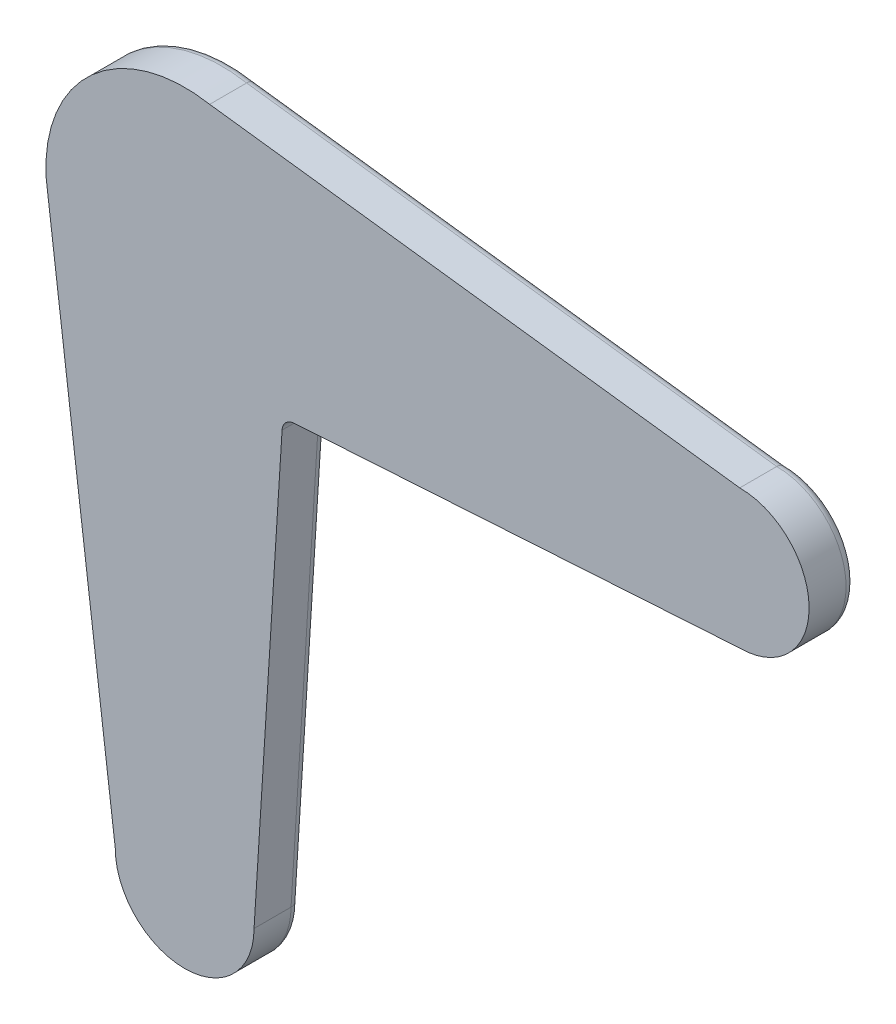
ISO-10303-21;
HEADER;
FILE_DESCRIPTION(('STEP AP214'),'2;1');
FILE_NAME('part.step','',(''),(''),'','','');
FILE_SCHEMA(('AUTOMOTIVE_DESIGN { 1 0 10303 214 1 1 1 1 }'));
ENDSEC;
DATA;
#1=APPLICATION_CONTEXT('core data for automotive mechanical design processes');
#2=APPLICATION_PROTOCOL_DEFINITION('international standard','automotive_design',2000,#1);
#3=PRODUCT_CONTEXT('',#1,'mechanical');
#4=PRODUCT('Part','Part','',(#3));
#5=PRODUCT_RELATED_PRODUCT_CATEGORY('part','',(#4));
#6=PRODUCT_DEFINITION_FORMATION('','',#4);
#7=PRODUCT_DEFINITION_CONTEXT('part definition',#1,'design');
#8=PRODUCT_DEFINITION('design','',#6,#7);
#9=PRODUCT_DEFINITION_SHAPE('','',#8);
#10=(LENGTH_UNIT() NAMED_UNIT(*) SI_UNIT(.MILLI.,.METRE.));
#11=(NAMED_UNIT(*) PLANE_ANGLE_UNIT() SI_UNIT($,.RADIAN.));
#12=(NAMED_UNIT(*) SI_UNIT($,.STERADIAN.) SOLID_ANGLE_UNIT());
#13=UNCERTAINTY_MEASURE_WITH_UNIT(LENGTH_MEASURE(1.E-05),#10,'distance_accuracy_value','');
#14=(GEOMETRIC_REPRESENTATION_CONTEXT(3) GLOBAL_UNCERTAINTY_ASSIGNED_CONTEXT((#13)) GLOBAL_UNIT_ASSIGNED_CONTEXT((#10,
#11,#12)) REPRESENTATION_CONTEXT('',''));
#15=CARTESIAN_POINT('',(0.,0.,0.));
#16=DIRECTION('',(0.,0.,1.));
#17=DIRECTION('',(1.,0.,0.));
#18=AXIS2_PLACEMENT_3D('',#15,#16,#17);
#19=CARTESIAN_POINT('',(93.5829057132578,739.119512955008,50.));
#20=DIRECTION('',(0.125611196920557,0.992079546814763,0.));
#21=DIRECTION('',(-0.992079546814763,0.125611196920557,0.));
#22=AXIS2_PLACEMENT_3D('',#19,#20,#21);
#23=PLANE('',#22);
#24=DIRECTION('',(0.,0.,-1.));
#25=VECTOR('',#24,1.);
#26=CARTESIAN_POINT('',(600.,675.,50.));
#27=LINE('',#26,#25);
#28=CARTESIAN_POINT('',(600.,675.,50.));
#29=VERTEX_POINT('',#28);
#30=CARTESIAN_POINT('',(600.,675.,9.99999999999999));
#31=VERTEX_POINT('',#30);
#32=EDGE_CURVE('E210',#29,#31,#27,.T.);
#33=ORIENTED_EDGE('',*,*,#32,.T.);
#34=DIRECTION('',(0.992079546814763,-0.125611196920557,0.));
#35=VECTOR('',#34,1.);
#36=CARTESIAN_POINT('',(27.0026258161435,747.54951100913,10.));
#37=LINE('',#36,#35);
#38=CARTESIAN_POINT('',(27.0026258161435,747.54951100913,9.99999999999999));
#39=VERTEX_POINT('',#38);
#40=EDGE_CURVE('E11',#31,#39,#37,.F.);
#41=ORIENTED_EDGE('',*,*,#40,.T.);
#42=DIRECTION('',(0.,0.,-1.));
#43=VECTOR('',#42,1.);
#44=CARTESIAN_POINT('',(27.0026258161435,747.54951100913,50.));
#45=LINE('',#44,#43);
#46=CARTESIAN_POINT('',(27.0026258161435,747.54951100913,50.));
#47=VERTEX_POINT('',#46);
#48=EDGE_CURVE('E230',#47,#39,#45,.T.);
#49=ORIENTED_EDGE('',*,*,#48,.F.);
#50=DIRECTION('',(0.992079546814763,-0.125611196920557,0.));
#51=VECTOR('',#50,1.);
#52=CARTESIAN_POINT('',(93.5829057132578,739.119512955008,50.));
#53=LINE('',#52,#51);
#54=EDGE_CURVE('E191',#47,#29,#53,.T.);
#55=ORIENTED_EDGE('',*,*,#54,.T.);
#56=EDGE_LOOP('',(#33,#41,#49,#55));
#57=FACE_BOUND('',#56,.T.);
#58=ADVANCED_FACE('F35',(#57),#23,.T.);
#59=CARTESIAN_POINT('',(0.,600.,50.));
#60=DIRECTION('',(0.,0.,-1.));
#61=DIRECTION('',(-1.,0.,0.));
#62=AXIS2_PLACEMENT_3D('',#59,#60,#61);
#63=CYLINDRICAL_SURFACE('',#62,150.);
#64=ORIENTED_EDGE('',*,*,#48,.T.);
#65=CARTESIAN_POINT('',(0.,600.,9.99999999999999));
#66=DIRECTION('',(0.,0.,1.));
#67=DIRECTION('',(1.,0.,0.));
#68=AXIS2_PLACEMENT_3D('',#65,#66,#67);
#69=CIRCLE('',#68,150.);
#70=CARTESIAN_POINT('',(-147.54951100913,572.997374183855,9.99999999999999));
#71=VERTEX_POINT('',#70);
#72=EDGE_CURVE('E44',#39,#71,#69,.T.);
#73=ORIENTED_EDGE('',*,*,#72,.T.);
#74=DIRECTION('',(0.,0.,-1.));
#75=VECTOR('',#74,1.);
#76=CARTESIAN_POINT('',(-147.54951100913,572.997374183855,50.));
#77=LINE('',#76,#75);
#78=CARTESIAN_POINT('',(-147.54951100913,572.997374183855,50.));
#79=VERTEX_POINT('',#78);
#80=EDGE_CURVE('E227',#79,#71,#77,.T.);
#81=ORIENTED_EDGE('',*,*,#80,.F.);
#82=CARTESIAN_POINT('',(0.,600.,50.));
#83=DIRECTION('',(0.,0.,1.));
#84=DIRECTION('',(1.,0.,0.));
#85=AXIS2_PLACEMENT_3D('',#82,#83,#84);
#86=CIRCLE('',#85,150.);
#87=EDGE_CURVE('E194',#47,#79,#86,.T.);
#88=ORIENTED_EDGE('',*,*,#87,.F.);
#89=EDGE_LOOP('',(#64,#73,#81,#88));
#90=FACE_BOUND('',#89,.T.);
#91=ADVANCED_FACE('F374',(#90),#63,.T.);
#92=CARTESIAN_POINT('',(-73.8166370406139,-9.34622244868542,50.));
#93=DIRECTION('',(-0.992079546814763,-0.125611196920556,0.));
#94=DIRECTION('',(0.125611196920556,-0.992079546814763,0.));
#95=AXIS2_PLACEMENT_3D('',#92,#93,#94);
#96=PLANE('',#95);
#97=ORIENTED_EDGE('',*,*,#80,.T.);
#98=DIRECTION('',(-0.125611196920556,0.992079546814763,0.));
#99=VECTOR('',#98,1.);
#100=CARTESIAN_POINT('',(-75.,0.,10.));
#101=LINE('',#100,#99);
#102=CARTESIAN_POINT('',(-75.,0.,9.99999999999999));
#103=VERTEX_POINT('',#102);
#104=EDGE_CURVE('E255',#71,#103,#101,.F.);
#105=ORIENTED_EDGE('',*,*,#104,.T.);
#106=DIRECTION('',(0.,0.,-1.));
#107=VECTOR('',#106,1.);
#108=CARTESIAN_POINT('',(-75.,0.,50.));
#109=LINE('',#108,#107);
#110=CARTESIAN_POINT('',(-75.,0.,50.));
#111=VERTEX_POINT('',#110);
#112=EDGE_CURVE('E224',#111,#103,#109,.T.);
#113=ORIENTED_EDGE('',*,*,#112,.F.);
#114=DIRECTION('',(-0.125611196920556,0.992079546814763,0.));
#115=VECTOR('',#114,1.);
#116=CARTESIAN_POINT('',(-73.8166370406139,-9.34622244868542,50.));
#117=LINE('',#116,#115);
#118=EDGE_CURVE('E196',#111,#79,#117,.T.);
#119=ORIENTED_EDGE('',*,*,#118,.T.);
#120=EDGE_LOOP('',(#97,#105,#113,#119));
#121=FACE_BOUND('',#120,.T.);
#122=ADVANCED_FACE('F377',(#121),#96,.T.);
#123=CARTESIAN_POINT('',(0.,0.,50.));
#124=DIRECTION('',(0.,0.,-1.));
#125=DIRECTION('',(-1.,0.,0.));
#126=AXIS2_PLACEMENT_3D('',#123,#124,#125);
#127=CYLINDRICAL_SURFACE('',#126,75.);
#128=ORIENTED_EDGE('',*,*,#112,.T.);
#129=CARTESIAN_POINT('',(0.,0.,9.99999999999999));
#130=DIRECTION('',(0.,0.,1.));
#131=DIRECTION('',(1.,0.,0.));
#132=AXIS2_PLACEMENT_3D('',#129,#130,#131);
#133=CIRCLE('',#132,75.);
#134=CARTESIAN_POINT('',(75.,0.,9.99999999999999));
#135=VERTEX_POINT('',#134);
#136=EDGE_CURVE('E258',#103,#135,#133,.T.);
#137=ORIENTED_EDGE('',*,*,#136,.T.);
#138=DIRECTION('',(0.,0.,-1.));
#139=VECTOR('',#138,1.);
#140=CARTESIAN_POINT('',(75.,0.,50.));
#141=LINE('',#140,#139);
#142=CARTESIAN_POINT('',(75.,0.,50.));
#143=VERTEX_POINT('',#142);
#144=EDGE_CURVE('E221',#143,#135,#141,.T.);
#145=ORIENTED_EDGE('',*,*,#144,.F.);
#146=CARTESIAN_POINT('',(0.,0.,50.));
#147=DIRECTION('',(0.,0.,1.));
#148=DIRECTION('',(1.,0.,0.));
#149=AXIS2_PLACEMENT_3D('',#146,#147,#148);
#150=CIRCLE('',#149,75.);
#151=EDGE_CURVE('E199',#111,#143,#150,.T.);
#152=ORIENTED_EDGE('',*,*,#151,.F.);
#153=EDGE_LOOP('',(#128,#137,#145,#152));
#154=FACE_BOUND('',#153,.T.);
#155=ADVANCED_FACE('F400',(#154),#127,.T.);
#156=CARTESIAN_POINT('',(74.7044846688428,-4.69854451142478,50.));
#157=DIRECTION('',(-0.998027953308208,0.0627710475890688,0.));
#158=DIRECTION('',(-0.0627710475890688,-0.998027953308208,0.));
#159=AXIS2_PLACEMENT_3D('',#156,#157,#158);
#160=PLANE('',#159);
#161=ORIENTED_EDGE('',*,*,#144,.T.);
#162=DIRECTION('',(0.0627710475890688,0.998027953308208,0.));
#163=VECTOR('',#162,1.);
#164=CARTESIAN_POINT('',(74.7044846688428,-4.69854451142478,9.99999999999999));
#165=LINE('',#164,#163);
#166=CARTESIAN_POINT('',(105.301411619995,481.777140624301,9.99999999999999));
#167=VERTEX_POINT('',#166);
#168=EDGE_CURVE('E264',#135,#167,#165,.T.);
#169=ORIENTED_EDGE('',*,*,#168,.T.);
#170=DIRECTION('',(0.,0.,-1.));
#171=VECTOR('',#170,1.);
#172=CARTESIAN_POINT('',(105.301411619995,481.777140624301,50.));
#173=LINE('',#172,#171);
#174=CARTESIAN_POINT('',(105.301411619995,481.777140624301,50.));
#175=VERTEX_POINT('',#174);
#176=EDGE_CURVE('E218',#175,#167,#173,.T.);
#177=ORIENTED_EDGE('',*,*,#176,.F.);
#178=DIRECTION('',(0.0627710475890688,0.998027953308208,0.));
#179=VECTOR('',#178,1.);
#180=CARTESIAN_POINT('',(74.7044846688428,-4.69854451142478,50.));
#181=LINE('',#180,#179);
#182=EDGE_CURVE('E201',#143,#175,#181,.T.);
#183=ORIENTED_EDGE('',*,*,#182,.F.);
#184=EDGE_LOOP('',(#161,#169,#177,#183));
#185=FACE_BOUND('',#184,.T.);
#186=ADVANCED_FACE('F398',(#185),#160,.F.);
#187=CARTESIAN_POINT('',(119.090100031217,480.909899968783,50.));
#188=DIRECTION('',(0.,0.,-1.));
#189=DIRECTION('',(-1.,0.,0.));
#190=AXIS2_PLACEMENT_3D('',#187,#188,#189);
#191=CYLINDRICAL_SURFACE('',#190,13.8159340783146);
#192=ORIENTED_EDGE('',*,*,#176,.T.);
#193=CARTESIAN_POINT('',(119.090100031217,480.909899968783,9.99999999999999));
#194=DIRECTION('',(0.,0.,1.));
#195=DIRECTION('',(1.,0.,0.));
#196=AXIS2_PLACEMENT_3D('',#193,#194,#195);
#197=CIRCLE('',#196,13.8159340783146);
#198=CARTESIAN_POINT('',(118.222859375699,494.698588380005,9.99999999999999));
#199=VERTEX_POINT('',#198);
#200=EDGE_CURVE('E262',#167,#199,#197,.F.);
#201=ORIENTED_EDGE('',*,*,#200,.T.);
#202=DIRECTION('',(0.,0.,-1.));
#203=VECTOR('',#202,1.);
#204=CARTESIAN_POINT('',(118.222859375699,494.698588380005,50.));
#205=LINE('',#204,#203);
#206=CARTESIAN_POINT('',(118.222859375699,494.698588380005,50.));
#207=VERTEX_POINT('',#206);
#208=EDGE_CURVE('E215',#207,#199,#205,.T.);
#209=ORIENTED_EDGE('',*,*,#208,.F.);
#210=CARTESIAN_POINT('',(119.090100031217,480.909899968783,50.));
#211=DIRECTION('',(0.,0.,1.));
#212=DIRECTION('',(1.,0.,0.));
#213=AXIS2_PLACEMENT_3D('',#210,#211,#212);
#214=CIRCLE('',#213,13.8159340783146);
#215=EDGE_CURVE('E203',#207,#175,#214,.T.);
#216=ORIENTED_EDGE('',*,*,#215,.T.);
#217=EDGE_LOOP('',(#192,#201,#209,#216));
#218=FACE_BOUND('',#217,.T.);
#219=ADVANCED_FACE('F394',(#218),#191,.F.);
#220=CARTESIAN_POINT('',(-30.5256889307161,485.343036590501,50.));
#221=DIRECTION('',(-0.0627710475890691,0.998027953308208,0.));
#222=DIRECTION('',(-0.998027953308208,-0.0627710475890691,0.));
#223=AXIS2_PLACEMENT_3D('',#220,#221,#222);
#224=PLANE('',#223);
#225=ORIENTED_EDGE('',*,*,#208,.T.);
#226=DIRECTION('',(0.998027953308208,0.0627710475890691,0.));
#227=VECTOR('',#226,1.);
#228=CARTESIAN_POINT('',(-30.5256889307161,485.343036590501,9.99999999999999));
#229=LINE('',#228,#227);
#230=CARTESIAN_POINT('',(600.,525.,9.99999999999999));
#231=VERTEX_POINT('',#230);
#232=EDGE_CURVE('E266',#199,#231,#229,.T.);
#233=ORIENTED_EDGE('',*,*,#232,.T.);
#234=DIRECTION('',(0.,0.,-1.));
#235=VECTOR('',#234,1.);
#236=CARTESIAN_POINT('',(600.,525.,50.));
#237=LINE('',#236,#235);
#238=CARTESIAN_POINT('',(600.,525.,50.));
#239=VERTEX_POINT('',#238);
#240=EDGE_CURVE('E212',#239,#231,#237,.T.);
#241=ORIENTED_EDGE('',*,*,#240,.F.);
#242=DIRECTION('',(0.998027953308208,0.0627710475890691,0.));
#243=VECTOR('',#242,1.);
#244=CARTESIAN_POINT('',(-30.5256889307161,485.343036590501,50.));
#245=LINE('',#244,#243);
#246=EDGE_CURVE('E206',#207,#239,#245,.T.);
#247=ORIENTED_EDGE('',*,*,#246,.F.);
#248=EDGE_LOOP('',(#225,#233,#241,#247));
#249=FACE_BOUND('',#248,.T.);
#250=ADVANCED_FACE('F391',(#249),#224,.F.);
#251=CARTESIAN_POINT('',(600.,600.,50.));
#252=DIRECTION('',(0.,0.,-1.));
#253=DIRECTION('',(-1.,0.,0.));
#254=AXIS2_PLACEMENT_3D('',#251,#252,#253);
#255=CYLINDRICAL_SURFACE('',#254,74.9999999999999);
#256=ORIENTED_EDGE('',*,*,#240,.T.);
#257=CARTESIAN_POINT('',(600.,600.,9.99999999999999));
#258=DIRECTION('',(0.,0.,1.));
#259=DIRECTION('',(1.,0.,0.));
#260=AXIS2_PLACEMENT_3D('',#257,#258,#259);
#261=CIRCLE('',#260,74.9999999999999);
#262=EDGE_CURVE('E260',#231,#31,#261,.T.);
#263=ORIENTED_EDGE('',*,*,#262,.T.);
#264=ORIENTED_EDGE('',*,*,#32,.F.);
#265=CARTESIAN_POINT('',(600.,600.,50.));
#266=DIRECTION('',(0.,0.,1.));
#267=DIRECTION('',(1.,0.,0.));
#268=AXIS2_PLACEMENT_3D('',#265,#266,#267);
#269=CIRCLE('',#268,74.9999999999999);
#270=EDGE_CURVE('E208',#239,#29,#269,.T.);
#271=ORIENTED_EDGE('',*,*,#270,.F.);
#272=EDGE_LOOP('',(#256,#263,#264,#271));
#273=FACE_BOUND('',#272,.T.);
#274=ADVANCED_FACE('F387',(#273),#255,.T.);
#275=CARTESIAN_POINT('',(0.,0.,50.));
#276=DIRECTION('',(0.,0.,1.));
#277=DIRECTION('',(1.,0.,0.));
#278=AXIS2_PLACEMENT_3D('',#275,#276,#277);
#279=PLANE('',#278);
#280=ORIENTED_EDGE('',*,*,#54,.F.);
#281=ORIENTED_EDGE('',*,*,#87,.T.);
#282=ORIENTED_EDGE('',*,*,#118,.F.);
#283=ORIENTED_EDGE('',*,*,#151,.T.);
#284=ORIENTED_EDGE('',*,*,#182,.T.);
#285=ORIENTED_EDGE('',*,*,#215,.F.);
#286=ORIENTED_EDGE('',*,*,#246,.T.);
#287=ORIENTED_EDGE('',*,*,#270,.T.);
#288=EDGE_LOOP('',(#280,#281,#282,#283,#284,#285,#286,#287));
#289=FACE_BOUND('',#288,.T.);
#290=ADVANCED_FACE('F382',(#289),#279,.T.);
#291=CARTESIAN_POINT('',(0.,0.,0.));
#292=DIRECTION('',(0.,0.,1.));
#293=DIRECTION('',(1.,0.,0.));
#294=AXIS2_PLACEMENT_3D('',#291,#292,#293);
#295=PLANE('',#294);
#296=CARTESIAN_POINT('',(119.090100031217,480.909899968783,0.));
#297=DIRECTION('',(0.,0.,1.));
#298=DIRECTION('',(1.,0.,0.));
#299=AXIS2_PLACEMENT_3D('',#296,#297,#298);
#300=CIRCLE('',#299,23.8159340783146);
#301=CARTESIAN_POINT('',(117.595148899809,504.678867913087,0.));
#302=VERTEX_POINT('',#301);
#303=CARTESIAN_POINT('',(95.3211320869132,482.404851100191,0.));
#304=VERTEX_POINT('',#303);
#305=EDGE_CURVE('E249',#302,#304,#300,.T.);
#306=ORIENTED_EDGE('',*,*,#305,.T.);
#307=DIRECTION('',(0.0627710475890688,0.998027953308208,0.));
#308=VECTOR('',#307,1.);
#309=CARTESIAN_POINT('',(64.7242051357608,-4.0708340355341,0.));
#310=LINE('',#309,#308);
#311=CARTESIAN_POINT('',(64.9992940492511,0.302940751623463,0.));
#312=VERTEX_POINT('',#311);
#313=EDGE_CURVE('E253',#304,#312,#310,.F.);
#314=ORIENTED_EDGE('',*,*,#313,.T.);
#315=CARTESIAN_POINT('',(0.,0.,0.));
#316=DIRECTION('',(0.,0.,1.));
#317=DIRECTION('',(1.,0.,0.));
#318=AXIS2_PLACEMENT_3D('',#315,#316,#317);
#319=CIRCLE('',#318,65.);
#320=CARTESIAN_POINT('',(-64.997155549145,0.608087592585069,0.));
#321=VERTEX_POINT('',#320);
#322=EDGE_CURVE('E251',#312,#321,#319,.F.);
#323=ORIENTED_EDGE('',*,*,#322,.T.);
#324=DIRECTION('',(-0.125611196920556,0.992079546814763,0.));
#325=VECTOR('',#324,1.);
#326=CARTESIAN_POINT('',(-137.628715540982,574.253486153061,0.));
#327=LINE('',#326,#325);
#328=CARTESIAN_POINT('',(-137.663902291286,574.531391755041,0.));
#329=VERTEX_POINT('',#328);
#330=EDGE_CURVE('E244',#321,#329,#327,.T.);
#331=ORIENTED_EDGE('',*,*,#330,.T.);
#332=CARTESIAN_POINT('',(0.,600.,0.));
#333=DIRECTION('',(0.,0.,1.));
#334=DIRECTION('',(1.,0.,0.));
#335=AXIS2_PLACEMENT_3D('',#332,#333,#334);
#336=CIRCLE('',#335,140.);
#337=CARTESIAN_POINT('',(25.4686082449571,737.663902291286,0.));
#338=VERTEX_POINT('',#337);
#339=EDGE_CURVE('E240',#329,#338,#336,.F.);
#340=ORIENTED_EDGE('',*,*,#339,.T.);
#341=DIRECTION('',(0.992079546814763,-0.125611196920557,0.));
#342=VECTOR('',#341,1.);
#343=CARTESIAN_POINT('',(598.743888030795,665.079204531852,0.));
#344=LINE('',#343,#342);
#345=CARTESIAN_POINT('',(599.391912407415,664.997155549145,0.));
#346=VERTEX_POINT('',#345);
#347=EDGE_CURVE('E238',#338,#346,#344,.T.);
#348=ORIENTED_EDGE('',*,*,#347,.T.);
#349=CARTESIAN_POINT('',(600.,600.,0.));
#350=DIRECTION('',(0.,0.,1.));
#351=DIRECTION('',(1.,0.,0.));
#352=AXIS2_PLACEMENT_3D('',#349,#350,#351);
#353=CIRCLE('',#352,64.9999999999999);
#354=CARTESIAN_POINT('',(599.697059248375,535.000705950749,0.));
#355=VERTEX_POINT('',#354);
#356=EDGE_CURVE('E242',#346,#355,#353,.F.);
#357=ORIENTED_EDGE('',*,*,#356,.T.);
#358=DIRECTION('',(0.998027953308208,0.0627710475890691,0.));
#359=VECTOR('',#358,1.);
#360=CARTESIAN_POINT('',(-31.1533994066068,495.323316123583,0.));
#361=LINE('',#360,#359);
#362=EDGE_CURVE('E247',#355,#302,#361,.F.);
#363=ORIENTED_EDGE('',*,*,#362,.T.);
#364=EDGE_LOOP('',(#306,#314,#323,#331,#340,#348,#357,#363));
#365=FACE_BOUND('',#364,.T.);
#366=CARTESIAN_POINT('',(1.62737108901607,598.372628910984,0.));
#367=DIRECTION('',(0.,0.,1.));
#368=DIRECTION('',(1.,0.,0.));
#369=AXIS2_PLACEMENT_3D('',#366,#367,#368);
#370=CIRCLE('',#369,125.);
#371=CARTESIAN_POINT('',(126.627371089016,598.372628910984,0.));
#372=VERTEX_POINT('',#371);
#373=EDGE_CURVE('E235',#372,#372,#370,.T.);
#374=ORIENTED_EDGE('',*,*,#373,.T.);
#375=EDGE_LOOP('',(#374));
#376=FACE_BOUND('',#375,.T.);
#377=ADVANCED_FACE('F353',(#365,#376),#295,.F.);
#378=CARTESIAN_POINT('',(1.62737108901607,598.372628910984,-50.));
#379=DIRECTION('',(0.,0.,1.));
#380=DIRECTION('',(1.,0.,0.));
#381=AXIS2_PLACEMENT_3D('',#378,#379,#380);
#382=CYLINDRICAL_SURFACE('',#381,85.);
#383=CARTESIAN_POINT('',(1.62737108901607,598.372628910984,-40.));
#384=DIRECTION('',(0.,0.,1.));
#385=DIRECTION('',(1.,0.,0.));
#386=AXIS2_PLACEMENT_3D('',#383,#384,#385);
#387=CIRCLE('',#386,85.);
#388=CARTESIAN_POINT('',(86.6273710890161,598.372628910984,-40.));
#389=VERTEX_POINT('',#388);
#390=EDGE_CURVE('E232',#389,#389,#387,.F.);
#391=ORIENTED_EDGE('',*,*,#390,.T.);
#392=EDGE_LOOP('',(#391));
#393=FACE_BOUND('',#392,.T.);
#394=CARTESIAN_POINT('',(1.62737108901607,598.372628910984,-50.));
#395=DIRECTION('',(0.,0.,-1.));
#396=DIRECTION('',(-1.,0.,0.));
#397=AXIS2_PLACEMENT_3D('',#394,#395,#396);
#398=CIRCLE('',#397,85.);
#399=CARTESIAN_POINT('',(-83.3726289109839,598.372628910984,-50.));
#400=VERTEX_POINT('',#399);
#401=EDGE_CURVE('E188',#400,#400,#398,.T.);
#402=ORIENTED_EDGE('',*,*,#401,.F.);
#403=EDGE_LOOP('',(#402));
#404=FACE_BOUND('',#403,.T.);
#405=ADVANCED_FACE('F424',(#393,#404),#382,.T.);
#406=CARTESIAN_POINT('',(1.62737108901607,598.372628910984,-50.));
#407=DIRECTION('',(0.,0.,-1.));
#408=DIRECTION('',(-1.,0.,0.));
#409=AXIS2_PLACEMENT_3D('',#406,#407,#408);
#410=PLANE('',#409);
#411=DIRECTION('',(0.,1.,0.));
#412=VECTOR('',#411,1.);
#413=CARTESIAN_POINT('',(-43.3726289109839,643.372628910984,-50.));
#414=LINE('',#413,#412);
#415=CARTESIAN_POINT('',(-43.3726289109839,553.372628910984,-50.));
#416=VERTEX_POINT('',#415);
#417=CARTESIAN_POINT('',(-43.3726289109839,643.372628910984,-50.));
#418=VERTEX_POINT('',#417);
#419=EDGE_CURVE('E52',#416,#418,#414,.T.);
#420=ORIENTED_EDGE('',*,*,#419,.F.);
#421=DIRECTION('',(-1.,0.,0.));
#422=VECTOR('',#421,1.);
#423=CARTESIAN_POINT('',(46.6273710890161,553.372628910984,-50.));
#424=LINE('',#423,#422);
#425=CARTESIAN_POINT('',(46.6273710890161,553.372628910984,-50.));
#426=VERTEX_POINT('',#425);
#427=EDGE_CURVE('E169',#426,#416,#424,.T.);
#428=ORIENTED_EDGE('',*,*,#427,.F.);
#429=DIRECTION('',(0.,-1.,0.));
#430=VECTOR('',#429,1.);
#431=CARTESIAN_POINT('',(46.6273710890161,643.372628910984,-50.));
#432=LINE('',#431,#430);
#433=CARTESIAN_POINT('',(46.6273710890161,643.372628910984,-50.));
#434=VERTEX_POINT('',#433);
#435=EDGE_CURVE('E172',#434,#426,#432,.T.);
#436=ORIENTED_EDGE('',*,*,#435,.F.);
#437=DIRECTION('',(1.,0.,0.));
#438=VECTOR('',#437,1.);
#439=CARTESIAN_POINT('',(46.6273710890161,643.372628910984,-50.));
#440=LINE('',#439,#438);
#441=EDGE_CURVE('E178',#418,#434,#440,.T.);
#442=ORIENTED_EDGE('',*,*,#441,.F.);
#443=EDGE_LOOP('',(#420,#428,#436,#442));
#444=FACE_BOUND('',#443,.T.);
#445=ORIENTED_EDGE('',*,*,#401,.T.);
#446=EDGE_LOOP('',(#445));
#447=FACE_BOUND('',#446,.T.);
#448=ADVANCED_FACE('F417',(#444,#447),#410,.T.);
#449=CARTESIAN_POINT('',(1.62737108901607,598.372628910984,-40.));
#450=DIRECTION('',(0.,0.,1.));
#451=DIRECTION('',(1.,0.,0.));
#452=AXIS2_PLACEMENT_3D('',#449,#450,#451);
#453=TOROIDAL_SURFACE('',#452,125.,40.);
#454=ORIENTED_EDGE('',*,*,#373,.F.);
#455=EDGE_LOOP('',(#454));
#456=FACE_BOUND('',#455,.T.);
#457=ORIENTED_EDGE('',*,*,#390,.F.);
#458=EDGE_LOOP('',(#457));
#459=FACE_BOUND('',#458,.T.);
#460=ADVANCED_FACE('F415',(#456,#459),#453,.F.);
#461=CARTESIAN_POINT('',(-31.1533994066068,495.323316123583,9.99999999999999));
#462=DIRECTION('',(0.998027953308208,0.0627710475890691,0.));
#463=DIRECTION('',(-0.0627710475890691,0.998027953308208,0.));
#464=AXIS2_PLACEMENT_3D('',#461,#462,#463);
#465=CYLINDRICAL_SURFACE('',#464,10.);
#466=CARTESIAN_POINT('',(600.,525.,9.99999999999999));
#467=CARTESIAN_POINT('',(600.000001140731,524.999969701703,9.71885147218893));
#468=CARTESIAN_POINT('',(599.99962755148,525.011855401897,9.43770734321424));
#469=CARTESIAN_POINT('',(599.998139146802,525.059239933539,8.8774311717151));
#470=CARTESIAN_POINT('',(599.997024367525,525.09473761338,8.59829903173285));
#471=CARTESIAN_POINT('',(599.994062857485,525.189094066738,8.04421734116968));
#472=CARTESIAN_POINT('',(599.992216642354,525.247936383271,7.76926498549212));
#473=CARTESIAN_POINT('',(599.987808369333,525.388552912383,7.22529782316024));
#474=CARTESIAN_POINT('',(599.985246320036,525.470326849667,6.95628294526783));
#475=CARTESIAN_POINT('',(599.979426703457,525.656270607427,6.42597436866631));
#476=CARTESIAN_POINT('',(599.976168812024,525.760450865799,6.16468433329282));
#477=CARTESIAN_POINT('',(599.96898581461,525.990444127002,5.65180809618506));
#478=CARTESIAN_POINT('',(599.965060694371,526.116257592102,5.40022210195197));
#479=CARTESIAN_POINT('',(599.95657745992,526.388587421892,4.90860543776131));
#480=CARTESIAN_POINT('',(599.952019495544,526.535098886127,4.66857205059339));
#481=CARTESIAN_POINT('',(599.942308215048,526.847803388125,4.20170209553433));
#482=CARTESIAN_POINT('',(599.937154902149,527.013996319417,3.97486545626229));
#483=CARTESIAN_POINT('',(599.926295048909,527.364911985583,3.53595946821612));
#484=CARTESIAN_POINT('',(599.920588414251,527.549637879745,3.32389264770563));
#485=CARTESIAN_POINT('',(599.908670048541,527.936281717484,2.91607311750183));
#486=CARTESIAN_POINT('',(599.902458317232,528.138199669821,2.72032041612187));
#487=CARTESIAN_POINT('',(599.889578867837,528.557859630161,2.34645666436035));
#488=CARTESIAN_POINT('',(599.882911003218,528.775606724672,2.16835132858392));
#489=CARTESIAN_POINT('',(599.869175702772,529.225314580898,1.83112002641056));
#490=CARTESIAN_POINT('',(599.86210827407,529.457275089134,1.67199372169212));
#491=CARTESIAN_POINT('',(599.847625643629,529.933938395543,1.37373567401934));
#492=CARTESIAN_POINT('',(599.840210192568,530.178650343033,1.23461856469759));
#493=CARTESIAN_POINT('',(599.825095887304,530.678914400302,0.977505871166412));
#494=CARTESIAN_POINT('',(599.817397038071,530.934466319986,0.859509916756882));
#495=CARTESIAN_POINT('',(599.801781548151,531.454436984376,0.645539807073264));
#496=CARTESIAN_POINT('',(599.793865048321,531.718850017592,0.549551767865488));
#497=CARTESIAN_POINT('',(599.777874153709,532.254722696021,0.380208376083171));
#498=CARTESIAN_POINT('',(599.76979980558,532.526180266694,0.306846440558096));
#499=CARTESIAN_POINT('',(599.751347307549,533.148701458898,0.166459949278971));
#500=CARTESIAN_POINT('',(599.740938317148,533.501385862308,0.106551748028766));
#501=CARTESIAN_POINT('',(599.720101724843,534.21065743594,0.0248743324449232));
#502=CARTESIAN_POINT('',(599.70967418183,534.567237221437,0.00304246440366789));
#503=CARTESIAN_POINT('',(599.698552307463,534.949378718762,9.85949949536626E-05));
#504=CARTESIAN_POINT('',(599.697805628397,534.97504303859,-1.88019125372401E-07));
#505=CARTESIAN_POINT('',(599.697059248376,535.000705950749,0.));
#506=B_SPLINE_CURVE_WITH_KNOTS('',3,(#466,#467,#468,#469,#470,#471,#472,#473,#474,#475,#476,
#477,#478,#479,#480,#481,#482,#483,#484,#485,#486,#487,#488,#489,#490,#491,#492,#493,#494,#495,
#496,#497,#498,#499,#500,#501,#502,#503,#504,#505),.UNSPECIFIED.,.F.,.F.,(4,2,2,2,2,2,2,2,2,2,2,
2,2,2,2,2,2,2,2,4),(0.,0.843187992217813,1.6863348634094,2.52888840481803,3.37143183173612,
4.21436860762245,5.05732339801651,5.90007894400332,6.74282993112166,7.58572482564909,
8.42862014969672,9.2717875358194,10.1149398893352,10.9587057766841,11.8024568735152,
12.6456742070953,13.4886459789163,14.5602669226833,15.6301228699346,15.7071481049026),.UNSPECIFIED.);
#507=EDGE_CURVE('E331',#231,#355,#506,.T.);
#508=ORIENTED_EDGE('',*,*,#507,.F.);
#509=ORIENTED_EDGE('',*,*,#232,.F.);
#510=CARTESIAN_POINT('',(117.595148899809,504.678867913087,10.));
#511=DIRECTION('',(-0.998027953308208,-0.0627710475890662,0.));
#512=DIRECTION('',(0.0627710475890662,-0.998027953308208,0.));
#513=AXIS2_PLACEMENT_3D('',#510,#511,#512);
#514=CIRCLE('',#513,10.);
#515=EDGE_CURVE('E39',#302,#199,#514,.T.);
#516=ORIENTED_EDGE('',*,*,#515,.F.);
#517=ORIENTED_EDGE('',*,*,#362,.F.);
#518=EDGE_LOOP('',(#508,#509,#516,#517));
#519=FACE_BOUND('',#518,.T.);
#520=ADVANCED_FACE('F328',(#519),#465,.T.);
#521=CARTESIAN_POINT('',(119.090100031217,480.909899968783,9.99999999999999));
#522=DIRECTION('',(0.,0.,1.));
#523=DIRECTION('',(1.,0.,0.));
#524=AXIS2_PLACEMENT_3D('',#521,#522,#523);
#525=TOROIDAL_SURFACE('',#524,23.8159340783146,10.);
#526=ORIENTED_EDGE('',*,*,#515,.T.);
#527=ORIENTED_EDGE('',*,*,#200,.F.);
#528=CARTESIAN_POINT('',(95.3211320869132,482.404851100191,10.));
#529=DIRECTION('',(-0.062771047589072,-0.998027953308208,0.));
#530=DIRECTION('',(0.998027953308208,-0.062771047589072,0.));
#531=AXIS2_PLACEMENT_3D('',#528,#529,#530);
#532=CIRCLE('',#531,10.);
#533=EDGE_CURVE('E337',#304,#167,#532,.T.);
#534=ORIENTED_EDGE('',*,*,#533,.F.);
#535=ORIENTED_EDGE('',*,*,#305,.F.);
#536=EDGE_LOOP('',(#526,#527,#534,#535));
#537=FACE_BOUND('',#536,.T.);
#538=ADVANCED_FACE('F37',(#537),#525,.T.);
#539=CARTESIAN_POINT('',(600.,600.,9.99999999999999));
#540=DIRECTION('',(0.,0.,1.));
#541=DIRECTION('',(1.,0.,0.));
#542=AXIS2_PLACEMENT_3D('',#539,#540,#541);
#543=TOROIDAL_SURFACE('',#542,64.9999999999999,10.);
#544=ORIENTED_EDGE('',*,*,#507,.T.);
#545=ORIENTED_EDGE('',*,*,#356,.F.);
#546=CARTESIAN_POINT('',(600.,675.,9.99999999999999));
#547=CARTESIAN_POINT('',(600.000002300305,675.000030478584,9.71916182706661));
#548=CARTESIAN_POINT('',(599.999254117737,674.988170770782,9.43832819636375));
#549=CARTESIAN_POINT('',(599.996273395971,674.940891234942,8.87867301267733));
#550=CARTESIAN_POINT('',(599.994040933312,674.905472621759,8.59985135669223));
#551=CARTESIAN_POINT('',(599.988110466996,674.81133056288,8.04639995970683));
#552=CARTESIAN_POINT('',(599.98441355629,674.752624497104,7.77176725077988));
#553=CARTESIAN_POINT('',(599.975586658694,674.612339008736,7.22843465508278));
#554=CARTESIAN_POINT('',(599.970456688251,674.530759848666,6.95973470025866));
#555=CARTESIAN_POINT('',(599.958804721192,674.345268507945,6.43005206209556));
#556=CARTESIAN_POINT('',(599.952282097494,674.241346266547,6.16907291574116));
#557=CARTESIAN_POINT('',(599.937901731417,674.011933865167,5.65680452416118));
#558=CARTESIAN_POINT('',(599.930043959528,673.886443228491,5.40551549325173));
#559=CARTESIAN_POINT('',(599.913062004814,673.614824757268,4.91446910416311));
#560=CARTESIAN_POINT('',(599.903938107358,673.468701572897,4.67470916382848));
#561=CARTESIAN_POINT('',(599.884499582704,673.156842036921,4.20835670043894));
#562=CARTESIAN_POINT('',(599.874184961223,672.99110577947,3.98176411418206));
#563=CARTESIAN_POINT('',(599.852442626785,672.641061420631,3.54316767635451));
#564=CARTESIAN_POINT('',(599.841014026092,672.456738503324,3.33117569348586));
#565=CARTESIAN_POINT('',(599.817145829936,672.070946709399,2.9234754141659));
#566=CARTESIAN_POINT('',(599.804706232636,671.869477801646,2.72776714728367));
#567=CARTESIAN_POINT('',(599.778914635105,671.450763035867,2.35395310999929));
#568=CARTESIAN_POINT('',(599.76556234929,671.233512238281,2.17585289226376));
#569=CARTESIAN_POINT('',(599.738058236648,670.78483880811,1.83857904193911));
#570=CARTESIAN_POINT('',(599.723906422897,670.5534164073,1.67940509994106));
#571=CARTESIAN_POINT('',(599.694886478816,670.077531811702,1.38077781184618));
#572=CARTESIAN_POINT('',(599.680016886497,669.833042884021,1.241367206435));
#573=CARTESIAN_POINT('',(599.649708892292,669.33322382991,0.983651476297915));
#574=CARTESIAN_POINT('',(599.634270499297,669.077893872977,0.865346021746486));
#575=CARTESIAN_POINT('',(599.602955558892,668.558348784052,0.650728163666995));
#576=CARTESIAN_POINT('',(599.587079271588,668.294138907149,0.554403006373108));
#577=CARTESIAN_POINT('',(599.555009147955,667.758660296486,0.384356985470687));
#578=CARTESIAN_POINT('',(599.538815402759,667.48739358143,0.310629732919299));
#579=CARTESIAN_POINT('',(599.501422204993,666.858830584003,0.167911299072217));
#580=CARTESIAN_POINT('',(599.480154342181,666.499746500498,0.106722899241108));
#581=CARTESIAN_POINT('',(599.437581863361,665.777555644755,0.0238606245577919));
#582=CARTESIAN_POINT('',(599.416277370429,665.414456707007,0.0021200656083686));
#583=CARTESIAN_POINT('',(599.394027747245,665.033397309253,4.91100945973867E-05));
#584=CARTESIAN_POINT('',(599.39296992722,665.01527607453,-9.3351721333587E-08));
#585=CARTESIAN_POINT('',(599.391912407416,664.997155549146,0.));
#586=B_SPLINE_CURVE_WITH_KNOTS('',3,(#546,#547,#548,#549,#550,#551,#552,#553,#554,#555,#556,
#557,#558,#559,#560,#561,#562,#563,#564,#565,#566,#567,#568,#569,#570,#571,#572,#573,#574,#575,
#576,#577,#578,#579,#580,#581,#582,#583,#584,#585),.UNSPECIFIED.,.F.,.F.,(4,2,2,2,2,2,2,2,2,2,2,
2,2,2,2,2,2,2,2,4),(0.,0.842256771194936,1.68447011334405,2.52605607279839,3.36763237349521,
4.20958841978406,5.05156307693439,5.89334827130785,6.73512942486388,7.57758696999875,
8.42004604489189,9.26276994597614,10.1054800682186,10.9499857273461,11.794478187614,
12.6384793896301,13.4822417526931,14.5747307387011,15.6653712140278,15.7198273561147),.UNSPECIFIED.);
#587=EDGE_CURVE('E308',#31,#346,#586,.T.);
#588=ORIENTED_EDGE('',*,*,#587,.F.);
#589=ORIENTED_EDGE('',*,*,#262,.F.);
#590=EDGE_LOOP('',(#544,#545,#588,#589));
#591=FACE_BOUND('',#590,.T.);
#592=ADVANCED_FACE('F323',(#591),#543,.T.);
#593=CARTESIAN_POINT('',(64.7242051357608,-4.0708340355341,9.99999999999999));
#594=DIRECTION('',(0.0627710475890688,0.998027953308208,0.));
#595=DIRECTION('',(-0.998027953308208,0.0627710475890688,0.));
#596=AXIS2_PLACEMENT_3D('',#593,#594,#595);
#597=CYLINDRICAL_SURFACE('',#596,10.);
#598=ORIENTED_EDGE('',*,*,#533,.T.);
#599=ORIENTED_EDGE('',*,*,#168,.F.);
#600=CARTESIAN_POINT('',(75.,0.,9.99999999999999));
#601=CARTESIAN_POINT('',(75.0000302982974,-1.14073198448942E-06,9.71885147218893));
#602=CARTESIAN_POINT('',(74.9881445981027,0.000372448519494462,9.43770734321424));
#603=CARTESIAN_POINT('',(74.9407600664611,0.001860853197513,8.8774311717151));
#604=CARTESIAN_POINT('',(74.9052623866199,0.00297563247466425,8.59829903173286));
#605=CARTESIAN_POINT('',(74.8109059332623,0.00593714251477258,8.04421734116968));
#606=CARTESIAN_POINT('',(74.7520636167292,0.00778335764506075,7.7692649854921));
#607=CARTESIAN_POINT('',(74.6114470876167,0.0121916306659475,7.22529782316022));
#608=CARTESIAN_POINT('',(74.5296731503332,0.0147536799628975,6.95628294526782));
#609=CARTESIAN_POINT('',(74.3437293925736,0.0205732965425772,6.42597436866631));
#610=CARTESIAN_POINT('',(74.2395491342014,0.0238311879757097,6.16468433329283));
#611=CARTESIAN_POINT('',(74.0095558729977,0.0310141853897639,5.65180809618507));
#612=CARTESIAN_POINT('',(73.8837424078976,0.0349393056283236,5.40022210195199));
#613=CARTESIAN_POINT('',(73.6114125781079,0.0434225400790422,4.9086054377613));
#614=CARTESIAN_POINT('',(73.4649011138732,0.0479805044547435,4.66857205059334));
#615=CARTESIAN_POINT('',(73.1521966118754,0.0576917849509079,4.20170209553426));
#616=CARTESIAN_POINT('',(72.9860036805835,0.0628450978506947,3.97486545626226));
#617=CARTESIAN_POINT('',(72.6350880144167,0.0737049510903239,3.53595946821612));
#618=CARTESIAN_POINT('',(72.4503621202549,0.0794115857485284,3.32389264770565));
#619=CARTESIAN_POINT('',(72.0637182825163,0.0913299514581453,2.91607311750183));
#620=CARTESIAN_POINT('',(71.8618003301788,0.0975416827669419,2.72032041612185));
#621=CARTESIAN_POINT('',(71.4421403698391,0.110421132162349,2.34645666436032));
#622=CARTESIAN_POINT('',(71.2243932753285,0.117088996781074,2.16835132858392));
#623=CARTESIAN_POINT('',(70.7746854191016,0.130824297227249,1.83112002641059));
#624=CARTESIAN_POINT('',(70.5427249108663,0.13789172592873,1.67199372169214));
#625=CARTESIAN_POINT('',(70.0660616044571,0.152374356370356,1.37373567401935));
#626=CARTESIAN_POINT('',(69.8213496569666,0.159789807431141,1.23461856469759));
#627=CARTESIAN_POINT('',(69.3210855996979,0.174904112694854,0.977505871166389));
#628=CARTESIAN_POINT('',(69.0655336800139,0.18260296192768,0.859509916756837));
#629=CARTESIAN_POINT('',(68.5455630156239,0.19821845184822,0.64553980707322));
#630=CARTESIAN_POINT('',(68.2811499824076,0.206134951678412,0.549551767865462));
#631=CARTESIAN_POINT('',(67.7452773039793,0.222125846290536,0.380208376083173));
#632=CARTESIAN_POINT('',(67.4738197333063,0.230200194418908,0.306846440558103));
#633=CARTESIAN_POINT('',(66.8512985411018,0.248652692451173,0.166459949278989));
#634=CARTESIAN_POINT('',(66.4986141376928,0.259061682855639,0.106551748028794));
#635=CARTESIAN_POINT('',(65.7893425640604,0.279898275152102,0.0248743324449435));
#636=CARTESIAN_POINT('',(65.4327627785628,0.290325818153641,0.0030424644036799));
#637=CARTESIAN_POINT('',(65.0506212812379,0.301447692533732,9.85949949547561E-05));
#638=CARTESIAN_POINT('',(65.0249569614101,0.302194371601372,-1.88019124996455E-07));
#639=CARTESIAN_POINT('',(64.9992940492511,0.302940751623433,0.));
#640=B_SPLINE_CURVE_WITH_KNOTS('',3,(#600,#601,#602,#603,#604,#605,#606,#607,#608,#609,#610,
#611,#612,#613,#614,#615,#616,#617,#618,#619,#620,#621,#622,#623,#624,#625,#626,#627,#628,#629,
#630,#631,#632,#633,#634,#635,#636,#637,#638,#639),.UNSPECIFIED.,.F.,.F.,(4,2,2,2,2,2,2,2,2,2,2,
2,2,2,2,2,2,2,2,4),(0.,0.843187992217807,1.6863348634094,2.52888840481806,3.37143183173613,
4.21436860762242,5.05732339801654,5.90007894400339,6.74282993112164,7.58572482564912,
8.42862014969675,9.2717875358194,10.1149398893352,10.9587057766841,11.8024568735154,
12.6456742070954,13.4886459789162,14.5602669226831,15.6301228699344,15.7071481049026),.UNSPECIFIED.);
#641=EDGE_CURVE('E301',#312,#135,#640,.F.);
#642=ORIENTED_EDGE('',*,*,#641,.F.);
#643=ORIENTED_EDGE('',*,*,#313,.F.);
#644=EDGE_LOOP('',(#598,#599,#642,#643));
#645=FACE_BOUND('',#644,.T.);
#646=ADVANCED_FACE('F320',(#645),#597,.T.);
#647=CARTESIAN_POINT('',(92.3267937440523,729.198717486861,10.));
#648=DIRECTION('',(-0.992079546814763,0.125611196920557,0.));
#649=DIRECTION('',(-0.125611196920557,-0.992079546814763,0.));
#650=AXIS2_PLACEMENT_3D('',#647,#648,#649);
#651=CYLINDRICAL_SURFACE('',#650,10.);
#652=ORIENTED_EDGE('',*,*,#587,.T.);
#653=ORIENTED_EDGE('',*,*,#347,.F.);
#654=CARTESIAN_POINT('',(27.0026258161435,747.54951100913,9.99999999999999));
#655=CARTESIAN_POINT('',(27.002630367043,747.549540968461,9.71882689204154));
#656=CARTESIAN_POINT('',(27.0008124468249,747.537788465117,9.43765817327576));
#657=CARTESIAN_POINT('',(26.9935645397246,747.490934944299,8.87733284479614));
#658=CARTESIAN_POINT('',(26.9881347283096,747.45583506105,8.59817613800385));
#659=CARTESIAN_POINT('',(26.9737009665661,747.362535848011,8.04404464775134));
#660=CARTESIAN_POINT('',(26.9646995230342,747.3043527195,7.76906707136216));
#661=CARTESIAN_POINT('',(26.9431869891703,747.165311424365,7.22504985980453));
#662=CARTESIAN_POINT('',(26.9306759410956,747.084453530755,6.95601015318353));
#663=CARTESIAN_POINT('',(26.902224640173,746.900592640996,6.42565224994959));
#664=CARTESIAN_POINT('',(26.8862827850832,746.79757929791,6.1643377261965));
#665=CARTESIAN_POINT('',(26.8510847230326,746.57016223446,5.65141359034138));
#666=CARTESIAN_POINT('',(26.8318284454199,746.445758058119,5.39980418525873));
#667=CARTESIAN_POINT('',(26.7901416280991,746.176479031708,4.90814256733425));
#668=CARTESIAN_POINT('',(26.7677118433314,746.031609050229,4.66808762396995));
#669=CARTESIAN_POINT('',(26.719831846539,745.722408390672,4.20117677600673));
#670=CARTESIAN_POINT('',(26.6943816509972,745.558077818795,3.97432079938923));
#671=CARTESIAN_POINT('',(26.6406357342195,745.211103042897,3.53538914601155));
#672=CARTESIAN_POINT('',(26.6123396571721,745.028456548903,3.32331532304254));
#673=CARTESIAN_POINT('',(26.5531030875253,744.6461666817,2.91548417492448));
#674=CARTESIAN_POINT('',(26.5221625938445,744.446523301541,2.71972685644673));
#675=CARTESIAN_POINT('',(26.4578438575957,744.031592172841,2.3458566647264));
#676=CARTESIAN_POINT('',(26.4244648259208,743.816299360284,2.16774954738848));
#677=CARTESIAN_POINT('',(26.3555130922041,743.371662593676,1.83051897700018));
#678=CARTESIAN_POINT('',(26.3199404296545,743.142318892586,1.67139518234155));
#679=CARTESIAN_POINT('',(26.2468282381426,742.671060861772,1.37316329875529));
#680=CARTESIAN_POINT('',(26.2092875004981,742.429138807892,1.23406771120996));
#681=CARTESIAN_POINT('',(26.1325248912202,741.934582686605,0.976999866532098));
#682=CARTESIAN_POINT('',(26.0933030494065,741.681948809206,0.859027234908702));
#683=CARTESIAN_POINT('',(26.0134792245551,741.167923251502,0.645107445539992));
#684=CARTESIAN_POINT('',(25.9728781452032,740.906537307162,0.549146173595005));
#685=CARTESIAN_POINT('',(25.8905730451011,740.376805339472,0.37985925785365));
#686=CARTESIAN_POINT('',(25.8488693507166,740.108461376087,0.306526995698225));
#687=CARTESIAN_POINT('',(25.7534143056,739.494419867635,0.166515390263305));
#688=CARTESIAN_POINT('',(25.69941241032,739.147154796872,0.106809476685576));
#689=CARTESIAN_POINT('',(25.5907742321406,738.448793046209,0.0252465188473752));
#690=CARTESIAN_POINT('',(25.5361391314897,738.097703563383,0.00332772040469403));
#691=CARTESIAN_POINT('',(25.4772016362337,737.719102020363,0.000116738312144945));
#692=CARTESIAN_POINT('',(25.4729048718467,737.691501324865,-2.22952653589488E-07));
#693=CARTESIAN_POINT('',(25.4686082449563,737.663902291287,0.));
#694=B_SPLINE_CURVE_WITH_KNOTS('',3,(#654,#655,#656,#657,#658,#659,#660,#661,#662,#663,#664,
#665,#666,#667,#668,#669,#670,#671,#672,#673,#674,#675,#676,#677,#678,#679,#680,#681,#682,#683,
#684,#685,#686,#687,#688,#689,#690,#691,#692,#693),.UNSPECIFIED.,.F.,.F.,(4,2,2,2,2,2,2,2,2,2,2,
2,2,2,2,2,2,2,2,4),(0.,0.84326174030125,1.68648251760494,2.52911251333599,3.37173236385876,
4.21474658868778,5.05777878587524,5.90061077163822,6.74343815815748,7.58637105198994,
8.42930429046833,9.27251151939193,10.115703572363,10.9594196757731,11.8031208193805,
12.6462794401781,13.4891912261757,14.5565953039348,15.6222533004073,15.706052345326),.UNSPECIFIED.);
#695=EDGE_CURVE('E309',#39,#338,#694,.T.);
#696=ORIENTED_EDGE('',*,*,#695,.F.);
#697=ORIENTED_EDGE('',*,*,#40,.F.);
#698=EDGE_LOOP('',(#652,#653,#696,#697));
#699=FACE_BOUND('',#698,.T.);
#700=ADVANCED_FACE('F295',(#699),#651,.T.);
#701=CARTESIAN_POINT('',(0.,0.,9.99999999999999));
#702=DIRECTION('',(0.,0.,1.));
#703=DIRECTION('',(1.,0.,0.));
#704=AXIS2_PLACEMENT_3D('',#701,#702,#703);
#705=TOROIDAL_SURFACE('',#704,65.,10.);
#706=ORIENTED_EDGE('',*,*,#641,.T.);
#707=ORIENTED_EDGE('',*,*,#136,.F.);
#708=CARTESIAN_POINT('',(-75.,0.,9.99999999999999));
#709=CARTESIAN_POINT('',(-75.0000304785842,-2.30030446733387E-06,9.71916182706661));
#710=CARTESIAN_POINT('',(-74.9881707707821,0.000745882264071168,9.43832819636375));
#711=CARTESIAN_POINT('',(-74.940891234942,0.00372660403013,8.87867301267733));
#712=CARTESIAN_POINT('',(-74.9054726217592,0.00595906668820334,8.59985135669223));
#713=CARTESIAN_POINT('',(-74.8113305628798,0.0118895330042006,8.04639995970682));
#714=CARTESIAN_POINT('',(-74.7526244971044,0.0155864437105422,7.77176725077988));
#715=CARTESIAN_POINT('',(-74.6123390087364,0.0244133413071221,7.22843465508277));
#716=CARTESIAN_POINT('',(-74.5307598486656,0.0295433117496703,6.95973470025866));
#717=CARTESIAN_POINT('',(-74.3452685079449,0.0411952788086612,6.43005206209555));
#718=CARTESIAN_POINT('',(-74.2413462665469,0.0477179025064115,6.16907291574113));
#719=CARTESIAN_POINT('',(-74.0119338651669,0.0620982685840829,5.65680452416113));
#720=CARTESIAN_POINT('',(-73.8864432284916,0.0699560404727006,5.40551549325169));
#721=CARTESIAN_POINT('',(-73.6148247572684,0.0869379951863694,4.91446910416307));
#722=CARTESIAN_POINT('',(-73.468701572897,0.0960618926432882,4.67470916382841));
#723=CARTESIAN_POINT('',(-73.1568420369217,0.115500417297181,4.20835670043888));
#724=CARTESIAN_POINT('',(-72.9911057794701,0.12581503877809,3.98176411418204));
#725=CARTESIAN_POINT('',(-72.6410614206311,0.147557373215454,3.54316767635449));
#726=CARTESIAN_POINT('',(-72.4567385033245,0.158985973908265,3.33117569348583));
#727=CARTESIAN_POINT('',(-72.0709467093987,0.182854170064988,2.92347541416586));
#728=CARTESIAN_POINT('',(-71.8694778016461,0.195293767364655,2.72776714728363));
#729=CARTESIAN_POINT('',(-71.4507630358674,0.221085364895387,2.35395310999924));
#730=CARTESIAN_POINT('',(-71.2335122382806,0.234437650710204,2.1758528922637));
#731=CARTESIAN_POINT('',(-70.7848388081105,0.261941763352763,1.83857904193907));
#732=CARTESIAN_POINT('',(-70.5534164073,0.276093577104149,1.67940509994103));
#733=CARTESIAN_POINT('',(-70.0775318117016,0.305113521185216,1.38077781184618));
#734=CARTESIAN_POINT('',(-69.833042884021,0.31998311350315,1.24136720643502));
#735=CARTESIAN_POINT('',(-69.3332238299099,0.350291107708912,0.983651476297933));
#736=CARTESIAN_POINT('',(-69.0778938729772,0.365729500703128,0.865346021746494));
#737=CARTESIAN_POINT('',(-68.5583487840526,0.397044441108998,0.65072816366702));
#738=CARTESIAN_POINT('',(-68.2941389071489,0.412920728413088,0.554403006373157));
#739=CARTESIAN_POINT('',(-67.7586602964866,0.444990852045548,0.384356985470717));
#740=CARTESIAN_POINT('',(-67.4873935814304,0.461184597241208,0.310629732919293));
#741=CARTESIAN_POINT('',(-66.8588305840029,0.498577795007465,0.167911299072158));
#742=CARTESIAN_POINT('',(-66.4997465004977,0.519845657818781,0.106722899241046));
#743=CARTESIAN_POINT('',(-65.7775556447541,0.562418136640193,0.0238606245577391));
#744=CARTESIAN_POINT('',(-65.4144567070066,0.583722629574956,0.00212006560833046));
#745=CARTESIAN_POINT('',(-65.0333973092521,0.605972252755889,4.91100945940866E-05));
#746=CARTESIAN_POINT('',(-65.0152760745296,0.60703007278115,-9.33517229379574E-08));
#747=CARTESIAN_POINT('',(-64.9971555491449,0.608087592585015,0.));
#748=B_SPLINE_CURVE_WITH_KNOTS('',3,(#708,#709,#710,#711,#712,#713,#714,#715,#716,#717,#718,
#719,#720,#721,#722,#723,#724,#725,#726,#727,#728,#729,#730,#731,#732,#733,#734,#735,#736,#737,
#738,#739,#740,#741,#742,#743,#744,#745,#746,#747),.UNSPECIFIED.,.F.,.F.,(4,2,2,2,2,2,2,2,2,2,2,
2,2,2,2,2,2,2,2,4),(0.,0.842256771194946,1.68447011334406,2.52605607279838,3.36763237349523,
4.20958841978409,5.05156307693446,5.89334827130792,6.73512942486393,7.57758696999878,
8.42004604489201,9.26276994597628,10.1054800682187,10.949985727346,11.7944781876139,
12.6384793896299,13.4822417526932,14.5747307387016,15.6653712140288,15.7198273561156),.UNSPECIFIED.);
#749=EDGE_CURVE('E276',#321,#103,#748,.F.);
#750=ORIENTED_EDGE('',*,*,#749,.F.);
#751=ORIENTED_EDGE('',*,*,#322,.F.);
#752=EDGE_LOOP('',(#706,#707,#750,#751));
#753=FACE_BOUND('',#752,.T.);
#754=ADVANCED_FACE('F290',(#753),#705,.T.);
#755=CARTESIAN_POINT('',(0.,600.,9.99999999999999));
#756=DIRECTION('',(0.,0.,1.));
#757=DIRECTION('',(1.,0.,0.));
#758=AXIS2_PLACEMENT_3D('',#755,#756,#757);
#759=TOROIDAL_SURFACE('',#758,140.,10.);
#760=ORIENTED_EDGE('',*,*,#695,.T.);
#761=ORIENTED_EDGE('',*,*,#339,.F.);
#762=CARTESIAN_POINT('',(-147.54951100913,572.997374183855,9.99999999999999));
#763=CARTESIAN_POINT('',(-147.549540968461,572.997369632955,9.71882689204155));
#764=CARTESIAN_POINT('',(-147.537788465116,572.999187553172,9.43765817327577));
#765=CARTESIAN_POINT('',(-147.490934944298,573.006435460272,8.87733284479614));
#766=CARTESIAN_POINT('',(-147.45583506105,573.011865271687,8.59817613800385));
#767=CARTESIAN_POINT('',(-147.362535848011,573.026299033431,8.04404464775134));
#768=CARTESIAN_POINT('',(-147.304352719499,573.035300476963,7.76906707136216));
#769=CARTESIAN_POINT('',(-147.165311424364,573.056813010827,7.22504985980453));
#770=CARTESIAN_POINT('',(-147.084453530755,573.069324058902,6.95601015318354));
#771=CARTESIAN_POINT('',(-146.900592640996,573.097775359824,6.4256522499496));
#772=CARTESIAN_POINT('',(-146.797579297909,573.113717214914,6.16433772619649));
#773=CARTESIAN_POINT('',(-146.570162234459,573.148915276964,5.65141359034136));
#774=CARTESIAN_POINT('',(-146.445758058118,573.168171554577,5.39980418525871));
#775=CARTESIAN_POINT('',(-146.176479031708,573.209858371898,4.90814256733423));
#776=CARTESIAN_POINT('',(-146.031609050228,573.232288156666,4.66808762396992));
#777=CARTESIAN_POINT('',(-145.722408390672,573.280168153458,4.20117677600671));
#778=CARTESIAN_POINT('',(-145.558077818794,573.305618349,3.97432079938922));
#779=CARTESIAN_POINT('',(-145.211103042896,573.359364265777,3.53538914601154));
#780=CARTESIAN_POINT('',(-145.028456548903,573.387660342824,3.32331532304253));
#781=CARTESIAN_POINT('',(-144.6461666817,573.446896912471,2.91548417492448));
#782=CARTESIAN_POINT('',(-144.446523301541,573.477837406152,2.71972685644672));
#783=CARTESIAN_POINT('',(-144.03159217284,573.542156142401,2.34585666472642));
#784=CARTESIAN_POINT('',(-143.816299360283,573.575535174076,2.16774954738853));
#785=CARTESIAN_POINT('',(-143.371662593676,573.644486907793,1.83051897700023));
#786=CARTESIAN_POINT('',(-143.142318892586,573.680059570343,1.67139518234158));
#787=CARTESIAN_POINT('',(-142.671060861771,573.753171761855,1.3731632987553));
#788=CARTESIAN_POINT('',(-142.429138807892,573.790712499499,1.23406771121));
#789=CARTESIAN_POINT('',(-141.934582686604,573.867475108776,0.976999866532123));
#790=CARTESIAN_POINT('',(-141.681948809205,573.90669695059,0.859027234908701));
#791=CARTESIAN_POINT('',(-141.167923251501,573.986520775442,0.645107445539968));
#792=CARTESIAN_POINT('',(-140.906537307161,574.027121854794,0.549146173594981));
#793=CARTESIAN_POINT('',(-140.376805339472,574.109426954896,0.379859257853642));
#794=CARTESIAN_POINT('',(-140.108461376087,574.151130649281,0.306526995698228));
#795=CARTESIAN_POINT('',(-139.494419867634,574.246585694396,0.16651539026336));
#796=CARTESIAN_POINT('',(-139.147154796871,574.300587589674,0.106809476685651));
#797=CARTESIAN_POINT('',(-138.44879304621,574.409225767858,0.0252465188474461));
#798=CARTESIAN_POINT('',(-138.097703563385,574.463860868517,0.00332772040474661));
#799=CARTESIAN_POINT('',(-137.719102020364,574.522798363765,0.000116738312151681));
#800=CARTESIAN_POINT('',(-137.691501324866,574.527095128151,-2.22952650318721E-07));
#801=CARTESIAN_POINT('',(-137.663902291288,574.53139175504,0.));
#802=B_SPLINE_CURVE_WITH_KNOTS('',3,(#762,#763,#764,#765,#766,#767,#768,#769,#770,#771,#772,
#773,#774,#775,#776,#777,#778,#779,#780,#781,#782,#783,#784,#785,#786,#787,#788,#789,#790,#791,
#792,#793,#794,#795,#796,#797,#798,#799,#800,#801),.UNSPECIFIED.,.F.,.F.,(4,2,2,2,2,2,2,2,2,2,2,
2,2,2,2,2,2,2,2,4),(0.,0.843261740301254,1.68648251760493,2.529112513336,3.37173236385875,
4.21474658868777,5.05777878587527,5.90061077163826,6.74343815815747,7.58637105199001,
8.42930429046825,9.27251151939188,10.1157035723629,10.959419675773,11.8031208193806,
12.6462794401782,13.4891912261757,14.5565953039341,15.6222533004061,15.7060523453249),.UNSPECIFIED.);
#803=EDGE_CURVE('E184',#71,#329,#802,.T.);
#804=ORIENTED_EDGE('',*,*,#803,.F.);
#805=ORIENTED_EDGE('',*,*,#72,.F.);
#806=EDGE_LOOP('',(#760,#761,#804,#805));
#807=FACE_BOUND('',#806,.T.);
#808=ADVANCED_FACE('F283',(#807),#759,.T.);
#809=CARTESIAN_POINT('',(-63.8958415724663,-8.09011047947985,10.));
#810=DIRECTION('',(0.125611196920556,-0.992079546814763,0.));
#811=DIRECTION('',(0.992079546814763,0.125611196920556,0.));
#812=AXIS2_PLACEMENT_3D('',#809,#810,#811);
#813=CYLINDRICAL_SURFACE('',#812,10.);
#814=ORIENTED_EDGE('',*,*,#749,.T.);
#815=ORIENTED_EDGE('',*,*,#104,.F.);
#816=ORIENTED_EDGE('',*,*,#803,.T.);
#817=ORIENTED_EDGE('',*,*,#330,.F.);
#818=EDGE_LOOP('',(#814,#815,#816,#817));
#819=FACE_BOUND('',#818,.T.);
#820=ADVANCED_FACE('F286',(#819),#813,.T.);
#821=CARTESIAN_POINT('',(-43.3726289109839,643.372628910984,0.));
#822=DIRECTION('',(-1.,0.,0.));
#823=DIRECTION('',(0.,-1.,0.));
#824=AXIS2_PLACEMENT_3D('',#821,#822,#823);
#825=PLANE('',#824);
#826=ORIENTED_EDGE('',*,*,#419,.T.);
#827=DIRECTION('',(0.,0.,-1.));
#828=VECTOR('',#827,1.);
#829=CARTESIAN_POINT('',(-43.3726289109839,643.372628910984,0.));
#830=LINE('',#829,#828);
#831=CARTESIAN_POINT('',(-43.3726289109839,643.372628910984,0.));
#832=VERTEX_POINT('',#831);
#833=EDGE_CURVE('E147',#832,#418,#830,.T.);
#834=ORIENTED_EDGE('',*,*,#833,.F.);
#835=DIRECTION('',(0.,1.,0.));
#836=VECTOR('',#835,1.);
#837=CARTESIAN_POINT('',(-43.3726289109839,643.372628910984,0.));
#838=LINE('',#837,#836);
#839=CARTESIAN_POINT('',(-43.3726289109839,553.372628910984,0.));
#840=VERTEX_POINT('',#839);
#841=EDGE_CURVE('E151',#840,#832,#838,.T.);
#842=ORIENTED_EDGE('',*,*,#841,.F.);
#843=DIRECTION('',(0.,0.,-1.));
#844=VECTOR('',#843,1.);
#845=CARTESIAN_POINT('',(-43.3726289109839,553.372628910984,0.));
#846=LINE('',#845,#844);
#847=EDGE_CURVE('E182',#840,#416,#846,.T.);
#848=ORIENTED_EDGE('',*,*,#847,.T.);
#849=EDGE_LOOP('',(#826,#834,#842,#848));
#850=FACE_BOUND('',#849,.T.);
#851=ADVANCED_FACE('F149',(#850),#825,.F.);
#852=CARTESIAN_POINT('',(46.6273710890161,553.372628910984,0.));
#853=DIRECTION('',(0.,-1.,0.));
#854=DIRECTION('',(0.,0.,-1.));
#855=AXIS2_PLACEMENT_3D('',#852,#853,#854);
#856=PLANE('',#855);
#857=ORIENTED_EDGE('',*,*,#427,.T.);
#858=ORIENTED_EDGE('',*,*,#847,.F.);
#859=DIRECTION('',(-1.,0.,0.));
#860=VECTOR('',#859,1.);
#861=CARTESIAN_POINT('',(46.6273710890161,553.372628910984,0.));
#862=LINE('',#861,#860);
#863=CARTESIAN_POINT('',(46.6273710890161,553.372628910984,0.));
#864=VERTEX_POINT('',#863);
#865=EDGE_CURVE('E157',#864,#840,#862,.T.);
#866=ORIENTED_EDGE('',*,*,#865,.F.);
#867=DIRECTION('',(0.,0.,-1.));
#868=VECTOR('',#867,1.);
#869=CARTESIAN_POINT('',(46.6273710890161,553.372628910984,0.));
#870=LINE('',#869,#868);
#871=EDGE_CURVE('E185',#864,#426,#870,.T.);
#872=ORIENTED_EDGE('',*,*,#871,.T.);
#873=EDGE_LOOP('',(#857,#858,#866,#872));
#874=FACE_BOUND('',#873,.T.);
#875=ADVANCED_FACE('F535',(#874),#856,.F.);
#876=CARTESIAN_POINT('',(46.6273710890161,643.372628910984,0.));
#877=DIRECTION('',(1.,0.,0.));
#878=DIRECTION('',(0.,1.,0.));
#879=AXIS2_PLACEMENT_3D('',#876,#877,#878);
#880=PLANE('',#879);
#881=ORIENTED_EDGE('',*,*,#435,.T.);
#882=ORIENTED_EDGE('',*,*,#871,.F.);
#883=DIRECTION('',(0.,-1.,0.));
#884=VECTOR('',#883,1.);
#885=CARTESIAN_POINT('',(46.6273710890161,643.372628910984,0.));
#886=LINE('',#885,#884);
#887=CARTESIAN_POINT('',(46.6273710890161,643.372628910984,0.));
#888=VERTEX_POINT('',#887);
#889=EDGE_CURVE('E165',#888,#864,#886,.T.);
#890=ORIENTED_EDGE('',*,*,#889,.F.);
#891=DIRECTION('',(0.,0.,-1.));
#892=VECTOR('',#891,1.);
#893=CARTESIAN_POINT('',(46.6273710890161,643.372628910984,0.));
#894=LINE('',#893,#892);
#895=EDGE_CURVE('E156',#888,#434,#894,.T.);
#896=ORIENTED_EDGE('',*,*,#895,.T.);
#897=EDGE_LOOP('',(#881,#882,#890,#896));
#898=FACE_BOUND('',#897,.T.);
#899=ADVANCED_FACE('F543',(#898),#880,.F.);
#900=CARTESIAN_POINT('',(46.6273710890161,643.372628910984,0.));
#901=DIRECTION('',(0.,1.,0.));
#902=DIRECTION('',(0.,0.,1.));
#903=AXIS2_PLACEMENT_3D('',#900,#901,#902);
#904=PLANE('',#903);
#905=ORIENTED_EDGE('',*,*,#441,.T.);
#906=ORIENTED_EDGE('',*,*,#895,.F.);
#907=DIRECTION('',(1.,0.,0.));
#908=VECTOR('',#907,1.);
#909=CARTESIAN_POINT('',(46.6273710890161,643.372628910984,0.));
#910=LINE('',#909,#908);
#911=EDGE_CURVE('E160',#832,#888,#910,.T.);
#912=ORIENTED_EDGE('',*,*,#911,.F.);
#913=ORIENTED_EDGE('',*,*,#833,.T.);
#914=EDGE_LOOP('',(#905,#906,#912,#913));
#915=FACE_BOUND('',#914,.T.);
#916=ADVANCED_FACE('F161',(#915),#904,.F.);
#917=CARTESIAN_POINT('',(0.,0.,0.));
#918=DIRECTION('',(0.,0.,-1.));
#919=DIRECTION('',(-1.,0.,0.));
#920=AXIS2_PLACEMENT_3D('',#917,#918,#919);
#921=PLANE('',#920);
#922=ORIENTED_EDGE('',*,*,#841,.T.);
#923=ORIENTED_EDGE('',*,*,#911,.T.);
#924=ORIENTED_EDGE('',*,*,#889,.T.);
#925=ORIENTED_EDGE('',*,*,#865,.T.);
#926=EDGE_LOOP('',(#922,#923,#924,#925));
#927=FACE_BOUND('',#926,.T.);
#928=ADVANCED_FACE('F167',(#927),#921,.T.);
#929=CLOSED_SHELL('',(#58,#91,#122,#155,#186,#219,#250,#274,#290,#377,#405,#448,#460,#520,#538,
#592,#646,#700,#754,#808,#820,#851,#875,#899,#916,#928));
#930=MANIFOLD_SOLID_BREP('B2',#929);
#931=ADVANCED_BREP_SHAPE_REPRESENTATION('',(#18,#930),#14);
#932=SHAPE_DEFINITION_REPRESENTATION(#9,#931);
ENDSEC;
END-ISO-10303-21;
